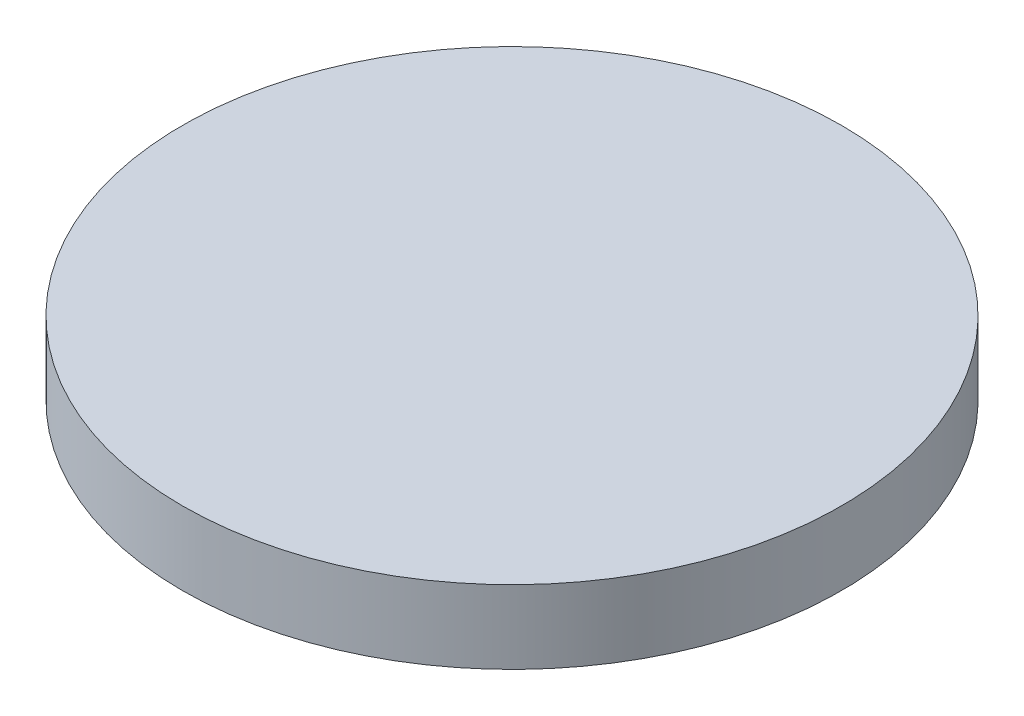
ISO-10303-21;
HEADER;
FILE_DESCRIPTION(('STEP AP214'),'2;1');
FILE_NAME('part.step','',(''),(''),'','','');
FILE_SCHEMA(('AUTOMOTIVE_DESIGN { 1 0 10303 214 1 1 1 1 }'));
ENDSEC;
DATA;
#1=APPLICATION_CONTEXT('core data for automotive mechanical design processes');
#2=APPLICATION_PROTOCOL_DEFINITION('international standard','automotive_design',2000,#1);
#3=PRODUCT_CONTEXT('',#1,'mechanical');
#4=PRODUCT('Part','Part','',(#3));
#5=PRODUCT_RELATED_PRODUCT_CATEGORY('part','',(#4));
#6=PRODUCT_DEFINITION_FORMATION('','',#4);
#7=PRODUCT_DEFINITION_CONTEXT('part definition',#1,'design');
#8=PRODUCT_DEFINITION('design','',#6,#7);
#9=PRODUCT_DEFINITION_SHAPE('','',#8);
#10=(LENGTH_UNIT() NAMED_UNIT(*) SI_UNIT(.MILLI.,.METRE.));
#11=(NAMED_UNIT(*) PLANE_ANGLE_UNIT() SI_UNIT($,.RADIAN.));
#12=(NAMED_UNIT(*) SI_UNIT($,.STERADIAN.) SOLID_ANGLE_UNIT());
#13=UNCERTAINTY_MEASURE_WITH_UNIT(LENGTH_MEASURE(1.E-05),#10,'distance_accuracy_value','');
#14=(GEOMETRIC_REPRESENTATION_CONTEXT(3) GLOBAL_UNCERTAINTY_ASSIGNED_CONTEXT((#13)) GLOBAL_UNIT_ASSIGNED_CONTEXT((#10,
#11,#12)) REPRESENTATION_CONTEXT('',''));
#15=CARTESIAN_POINT('',(0.,0.,0.));
#16=DIRECTION('',(0.,0.,1.));
#17=DIRECTION('',(1.,0.,0.));
#18=AXIS2_PLACEMENT_3D('',#15,#16,#17);
#19=CARTESIAN_POINT('',(0.,10.,0.));
#20=DIRECTION('',(0.,-1.,0.));
#21=DIRECTION('',(0.,0.,-1.));
#22=AXIS2_PLACEMENT_3D('',#19,#20,#21);
#23=CYLINDRICAL_SURFACE('',#22,44.9);
#24=CARTESIAN_POINT('',(0.,10.,0.));
#25=DIRECTION('',(0.,1.,0.));
#26=DIRECTION('',(0.,0.,1.));
#27=AXIS2_PLACEMENT_3D('',#24,#25,#26);
#28=CIRCLE('',#27,44.9);
#29=CARTESIAN_POINT('',(0.,10.,44.9));
#30=VERTEX_POINT('',#29);
#31=EDGE_CURVE('E10',#30,#30,#28,.T.);
#32=ORIENTED_EDGE('',*,*,#31,.F.);
#33=EDGE_LOOP('',(#32));
#34=FACE_BOUND('',#33,.T.);
#35=CARTESIAN_POINT('',(0.,0.,0.));
#36=DIRECTION('',(0.,1.,0.));
#37=DIRECTION('',(0.,0.,1.));
#38=AXIS2_PLACEMENT_3D('',#35,#36,#37);
#39=CIRCLE('',#38,44.9);
#40=CARTESIAN_POINT('',(0.,0.,44.9));
#41=VERTEX_POINT('',#40);
#42=EDGE_CURVE('E33',#41,#41,#39,.T.);
#43=ORIENTED_EDGE('',*,*,#42,.T.);
#44=EDGE_LOOP('',(#43));
#45=FACE_BOUND('',#44,.T.);
#46=ADVANCED_FACE('F30',(#34,#45),#23,.T.);
#47=CARTESIAN_POINT('',(0.,10.,0.));
#48=DIRECTION('',(0.,1.,0.));
#49=DIRECTION('',(0.,0.,1.));
#50=AXIS2_PLACEMENT_3D('',#47,#48,#49);
#51=PLANE('',#50);
#52=ORIENTED_EDGE('',*,*,#31,.T.);
#53=EDGE_LOOP('',(#52));
#54=FACE_BOUND('',#53,.T.);
#55=ADVANCED_FACE('F45',(#54),#51,.T.);
#56=CARTESIAN_POINT('',(0.,0.,0.));
#57=DIRECTION('',(0.,1.,0.));
#58=DIRECTION('',(0.,0.,1.));
#59=AXIS2_PLACEMENT_3D('',#56,#57,#58);
#60=PLANE('',#59);
#61=ORIENTED_EDGE('',*,*,#42,.F.);
#62=EDGE_LOOP('',(#61));
#63=FACE_BOUND('',#62,.T.);
#64=ADVANCED_FACE('F43',(#63),#60,.F.);
#65=CLOSED_SHELL('',(#46,#55,#64));
#66=MANIFOLD_SOLID_BREP('B2',#65);
#67=ADVANCED_BREP_SHAPE_REPRESENTATION('',(#18,#66),#14);
#68=SHAPE_DEFINITION_REPRESENTATION(#9,#67);
ENDSEC;
END-ISO-10303-21;
